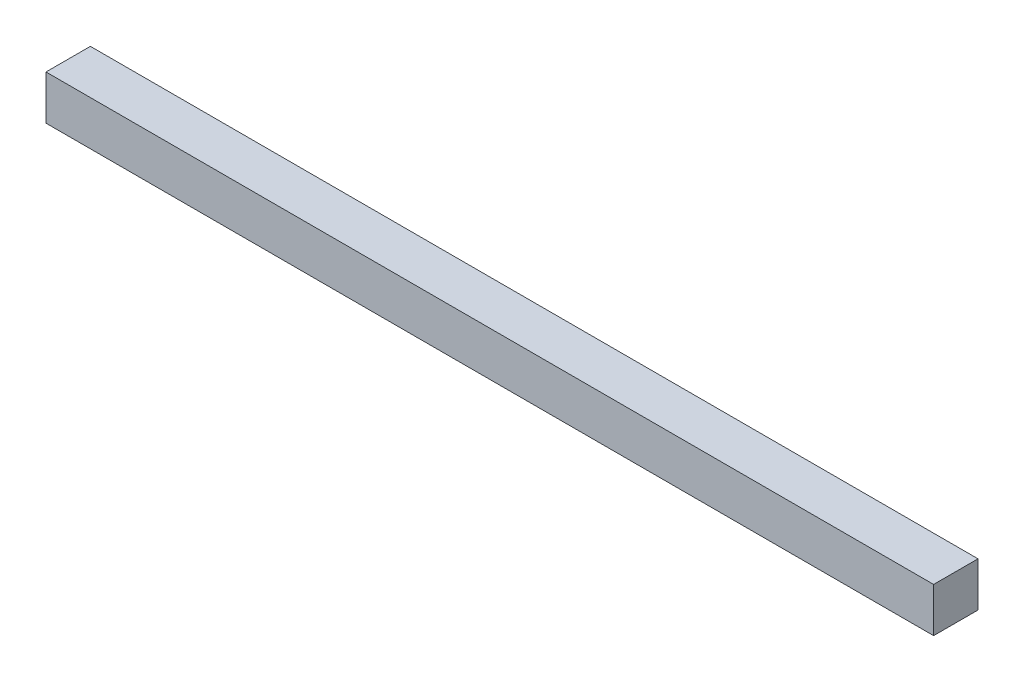
ISO-10303-21;
HEADER;
FILE_DESCRIPTION(('STEP AP214'),'2;1');
FILE_NAME('part.step','',(''),(''),'','','');
FILE_SCHEMA(('AUTOMOTIVE_DESIGN { 1 0 10303 214 1 1 1 1 }'));
ENDSEC;
DATA;
#1=APPLICATION_CONTEXT('core data for automotive mechanical design processes');
#2=APPLICATION_PROTOCOL_DEFINITION('international standard','automotive_design',2000,#1);
#3=PRODUCT_CONTEXT('',#1,'mechanical');
#4=PRODUCT('Part','Part','',(#3));
#5=PRODUCT_RELATED_PRODUCT_CATEGORY('part','',(#4));
#6=PRODUCT_DEFINITION_FORMATION('','',#4);
#7=PRODUCT_DEFINITION_CONTEXT('part definition',#1,'design');
#8=PRODUCT_DEFINITION('design','',#6,#7);
#9=PRODUCT_DEFINITION_SHAPE('','',#8);
#10=(LENGTH_UNIT() NAMED_UNIT(*) SI_UNIT(.MILLI.,.METRE.));
#11=(NAMED_UNIT(*) PLANE_ANGLE_UNIT() SI_UNIT($,.RADIAN.));
#12=(NAMED_UNIT(*) SI_UNIT($,.STERADIAN.) SOLID_ANGLE_UNIT());
#13=UNCERTAINTY_MEASURE_WITH_UNIT(LENGTH_MEASURE(1.E-05),#10,'distance_accuracy_value','');
#14=(GEOMETRIC_REPRESENTATION_CONTEXT(3) GLOBAL_UNCERTAINTY_ASSIGNED_CONTEXT((#13)) GLOBAL_UNIT_ASSIGNED_CONTEXT((#10,
#11,#12)) REPRESENTATION_CONTEXT('',''));
#15=CARTESIAN_POINT('',(0.,0.,0.));
#16=DIRECTION('',(0.,0.,1.));
#17=DIRECTION('',(1.,0.,0.));
#18=AXIS2_PLACEMENT_3D('',#15,#16,#17);
#19=CARTESIAN_POINT('',(99.9999999999999,-5.,10.));
#20=DIRECTION('',(-1.,0.,0.));
#21=DIRECTION('',(0.,0.,1.));
#22=AXIS2_PLACEMENT_3D('',#19,#20,#21);
#23=PLANE('',#22);
#24=DIRECTION('',(0.,1.,0.));
#25=VECTOR('',#24,1.);
#26=CARTESIAN_POINT('',(99.9999999999999,-5.,0.));
#27=LINE('',#26,#25);
#28=CARTESIAN_POINT('',(99.9999999999999,-5.,0.));
#29=VERTEX_POINT('',#28);
#30=CARTESIAN_POINT('',(99.9999999999999,5.,0.));
#31=VERTEX_POINT('',#30);
#32=EDGE_CURVE('E96',#29,#31,#27,.T.);
#33=ORIENTED_EDGE('',*,*,#32,.T.);
#34=DIRECTION('',(0.,0.,-1.));
#35=VECTOR('',#34,1.);
#36=CARTESIAN_POINT('',(99.9999999999999,5.,10.));
#37=LINE('',#36,#35);
#38=CARTESIAN_POINT('',(99.9999999999999,5.,10.));
#39=VERTEX_POINT('',#38);
#40=EDGE_CURVE('E11',#39,#31,#37,.T.);
#41=ORIENTED_EDGE('',*,*,#40,.F.);
#42=DIRECTION('',(0.,1.,0.));
#43=VECTOR('',#42,1.);
#44=CARTESIAN_POINT('',(99.9999999999999,-5.,10.));
#45=LINE('',#44,#43);
#46=CARTESIAN_POINT('',(99.9999999999999,-5.,10.));
#47=VERTEX_POINT('',#46);
#48=EDGE_CURVE('E84',#47,#39,#45,.T.);
#49=ORIENTED_EDGE('',*,*,#48,.F.);
#50=DIRECTION('',(0.,0.,-1.));
#51=VECTOR('',#50,1.);
#52=CARTESIAN_POINT('',(99.9999999999999,-5.,10.));
#53=LINE('',#52,#51);
#54=EDGE_CURVE('E92',#47,#29,#53,.T.);
#55=ORIENTED_EDGE('',*,*,#54,.T.);
#56=EDGE_LOOP('',(#33,#41,#49,#55));
#57=FACE_BOUND('',#56,.T.);
#58=ADVANCED_FACE('F33',(#57),#23,.F.);
#59=CARTESIAN_POINT('',(-100.,5.,10.));
#60=DIRECTION('',(0.,-1.,0.));
#61=DIRECTION('',(0.,0.,-1.));
#62=AXIS2_PLACEMENT_3D('',#59,#60,#61);
#63=PLANE('',#62);
#64=DIRECTION('',(-1.,0.,0.));
#65=VECTOR('',#64,1.);
#66=CARTESIAN_POINT('',(-100.,5.,0.));
#67=LINE('',#66,#65);
#68=CARTESIAN_POINT('',(-100.,5.,0.));
#69=VERTEX_POINT('',#68);
#70=EDGE_CURVE('E88',#31,#69,#67,.T.);
#71=ORIENTED_EDGE('',*,*,#70,.T.);
#72=DIRECTION('',(0.,0.,-1.));
#73=VECTOR('',#72,1.);
#74=CARTESIAN_POINT('',(-100.,5.,10.));
#75=LINE('',#74,#73);
#76=CARTESIAN_POINT('',(-100.,5.,10.));
#77=VERTEX_POINT('',#76);
#78=EDGE_CURVE('E41',#77,#69,#75,.T.);
#79=ORIENTED_EDGE('',*,*,#78,.F.);
#80=DIRECTION('',(-1.,0.,0.));
#81=VECTOR('',#80,1.);
#82=CARTESIAN_POINT('',(-100.,5.,10.));
#83=LINE('',#82,#81);
#84=EDGE_CURVE('E79',#39,#77,#83,.T.);
#85=ORIENTED_EDGE('',*,*,#84,.F.);
#86=ORIENTED_EDGE('',*,*,#40,.T.);
#87=EDGE_LOOP('',(#71,#79,#85,#86));
#88=FACE_BOUND('',#87,.T.);
#89=ADVANCED_FACE('F87',(#88),#63,.F.);
#90=CARTESIAN_POINT('',(-100.,-5.,10.));
#91=DIRECTION('',(1.,0.,0.));
#92=DIRECTION('',(0.,0.,-1.));
#93=AXIS2_PLACEMENT_3D('',#90,#91,#92);
#94=PLANE('',#93);
#95=DIRECTION('',(0.,-1.,0.));
#96=VECTOR('',#95,1.);
#97=CARTESIAN_POINT('',(-100.,-5.,0.));
#98=LINE('',#97,#96);
#99=CARTESIAN_POINT('',(-100.,-5.,0.));
#100=VERTEX_POINT('',#99);
#101=EDGE_CURVE('E66',#69,#100,#98,.T.);
#102=ORIENTED_EDGE('',*,*,#101,.T.);
#103=DIRECTION('',(0.,0.,-1.));
#104=VECTOR('',#103,1.);
#105=CARTESIAN_POINT('',(-100.,-5.,10.));
#106=LINE('',#105,#104);
#107=CARTESIAN_POINT('',(-100.,-5.,10.));
#108=VERTEX_POINT('',#107);
#109=EDGE_CURVE('E89',#108,#100,#106,.T.);
#110=ORIENTED_EDGE('',*,*,#109,.F.);
#111=DIRECTION('',(0.,-1.,0.));
#112=VECTOR('',#111,1.);
#113=CARTESIAN_POINT('',(-100.,-5.,10.));
#114=LINE('',#113,#112);
#115=EDGE_CURVE('E82',#77,#108,#114,.T.);
#116=ORIENTED_EDGE('',*,*,#115,.F.);
#117=ORIENTED_EDGE('',*,*,#78,.T.);
#118=EDGE_LOOP('',(#102,#110,#116,#117));
#119=FACE_BOUND('',#118,.T.);
#120=ADVANCED_FACE('F90',(#119),#94,.F.);
#121=CARTESIAN_POINT('',(-100.,-5.,10.));
#122=DIRECTION('',(0.,1.,0.));
#123=DIRECTION('',(0.,0.,1.));
#124=AXIS2_PLACEMENT_3D('',#121,#122,#123);
#125=PLANE('',#124);
#126=DIRECTION('',(1.,0.,0.));
#127=VECTOR('',#126,1.);
#128=CARTESIAN_POINT('',(-100.,-5.,0.));
#129=LINE('',#128,#127);
#130=EDGE_CURVE('E72',#100,#29,#129,.T.);
#131=ORIENTED_EDGE('',*,*,#130,.T.);
#132=ORIENTED_EDGE('',*,*,#54,.F.);
#133=DIRECTION('',(1.,0.,0.));
#134=VECTOR('',#133,1.);
#135=CARTESIAN_POINT('',(-100.,-5.,10.));
#136=LINE('',#135,#134);
#137=EDGE_CURVE('E49',#108,#47,#136,.T.);
#138=ORIENTED_EDGE('',*,*,#137,.F.);
#139=ORIENTED_EDGE('',*,*,#109,.T.);
#140=EDGE_LOOP('',(#131,#132,#138,#139));
#141=FACE_BOUND('',#140,.T.);
#142=ADVANCED_FACE('F103',(#141),#125,.F.);
#143=CARTESIAN_POINT('',(0.,0.,10.));
#144=DIRECTION('',(0.,0.,-1.));
#145=DIRECTION('',(-1.,0.,0.));
#146=AXIS2_PLACEMENT_3D('',#143,#144,#145);
#147=PLANE('',#146);
#148=ORIENTED_EDGE('',*,*,#48,.T.);
#149=ORIENTED_EDGE('',*,*,#84,.T.);
#150=ORIENTED_EDGE('',*,*,#115,.T.);
#151=ORIENTED_EDGE('',*,*,#137,.T.);
#152=EDGE_LOOP('',(#148,#149,#150,#151));
#153=FACE_BOUND('',#152,.T.);
#154=ADVANCED_FACE('F80',(#153),#147,.F.);
#155=CARTESIAN_POINT('',(0.,0.,0.));
#156=DIRECTION('',(0.,0.,-1.));
#157=DIRECTION('',(-1.,0.,0.));
#158=AXIS2_PLACEMENT_3D('',#155,#156,#157);
#159=PLANE('',#158);
#160=ORIENTED_EDGE('',*,*,#32,.F.);
#161=ORIENTED_EDGE('',*,*,#130,.F.);
#162=ORIENTED_EDGE('',*,*,#101,.F.);
#163=ORIENTED_EDGE('',*,*,#70,.F.);
#164=EDGE_LOOP('',(#160,#161,#162,#163));
#165=FACE_BOUND('',#164,.T.);
#166=ADVANCED_FACE('F106',(#165),#159,.T.);
#167=CLOSED_SHELL('',(#58,#89,#120,#142,#154,#166));
#168=MANIFOLD_SOLID_BREP('B2',#167);
#169=ADVANCED_BREP_SHAPE_REPRESENTATION('',(#18,#168),#14);
#170=SHAPE_DEFINITION_REPRESENTATION(#9,#169);
ENDSEC;
END-ISO-10303-21;
